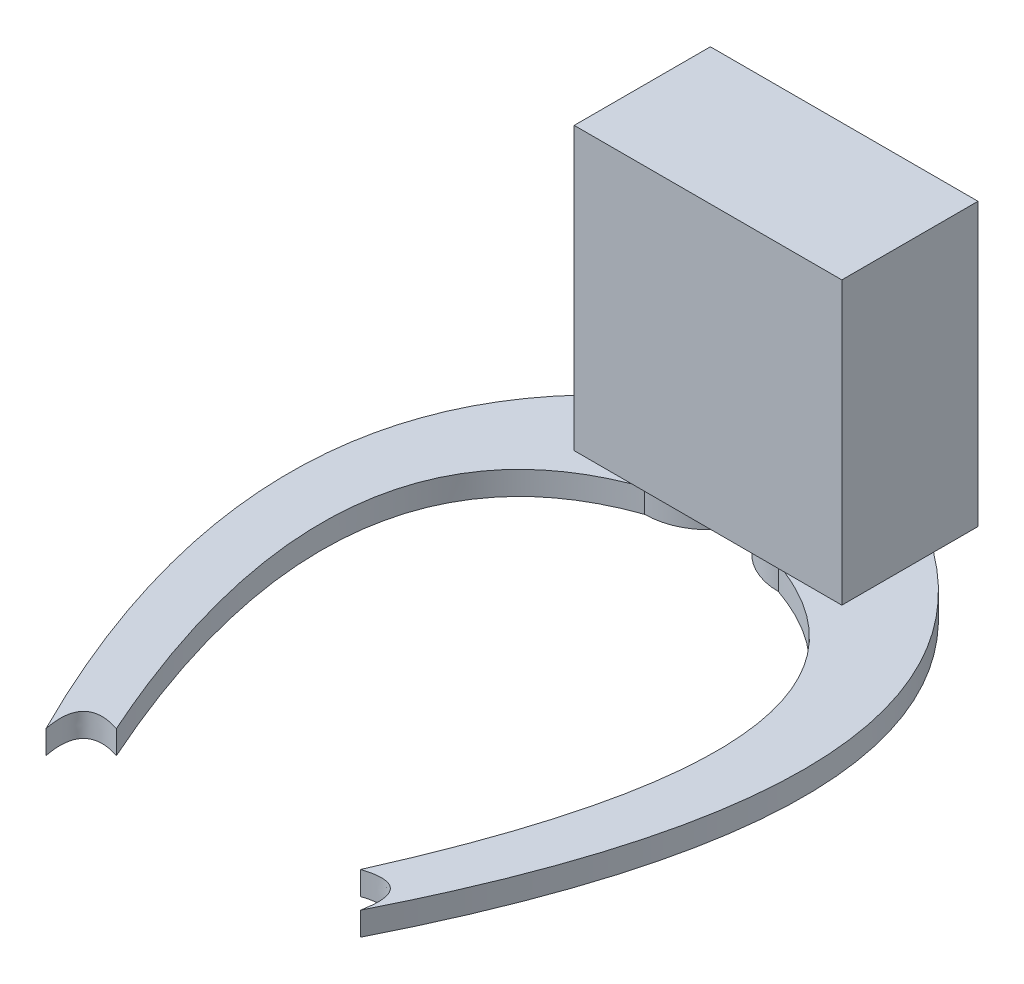
ISO-10303-21;
HEADER;
FILE_DESCRIPTION(('STEP AP214'),'2;1');
FILE_NAME('part.step','',(''),(''),'','','');
FILE_SCHEMA(('AUTOMOTIVE_DESIGN { 1 0 10303 214 1 1 1 1 }'));
ENDSEC;
DATA;
#1=APPLICATION_CONTEXT('core data for automotive mechanical design processes');
#2=APPLICATION_PROTOCOL_DEFINITION('international standard','automotive_design',2000,#1);
#3=PRODUCT_CONTEXT('',#1,'mechanical');
#4=PRODUCT('Part','Part','',(#3));
#5=PRODUCT_RELATED_PRODUCT_CATEGORY('part','',(#4));
#6=PRODUCT_DEFINITION_FORMATION('','',#4);
#7=PRODUCT_DEFINITION_CONTEXT('part definition',#1,'design');
#8=PRODUCT_DEFINITION('design','',#6,#7);
#9=PRODUCT_DEFINITION_SHAPE('','',#8);
#10=(LENGTH_UNIT() NAMED_UNIT(*) SI_UNIT(.MILLI.,.METRE.));
#11=(NAMED_UNIT(*) PLANE_ANGLE_UNIT() SI_UNIT($,.RADIAN.));
#12=(NAMED_UNIT(*) SI_UNIT($,.STERADIAN.) SOLID_ANGLE_UNIT());
#13=UNCERTAINTY_MEASURE_WITH_UNIT(LENGTH_MEASURE(1.E-05),#10,'distance_accuracy_value','');
#14=(GEOMETRIC_REPRESENTATION_CONTEXT(3) GLOBAL_UNCERTAINTY_ASSIGNED_CONTEXT((#13)) GLOBAL_UNIT_ASSIGNED_CONTEXT((#10,
#11,#12)) REPRESENTATION_CONTEXT('',''));
#15=CARTESIAN_POINT('',(0.,0.,0.));
#16=DIRECTION('',(0.,0.,1.));
#17=DIRECTION('',(1.,0.,0.));
#18=AXIS2_PLACEMENT_3D('',#15,#16,#17);
#19=CARTESIAN_POINT('',(-11.4,0.,11.6));
#20=DIRECTION('',(0.,1.,0.));
#21=DIRECTION('',(0.,0.,1.));
#22=AXIS2_PLACEMENT_3D('',#19,#20,#21);
#23=PLANE('',#22);
#24=CARTESIAN_POINT('',(10.4,0.,51.6));
#25=CARTESIAN_POINT('',(25.2903459098613,0.,18.1952198786538));
#26=CARTESIAN_POINT('',(5.7,0.,11.3));
#27=B_SPLINE_CURVE_WITH_KNOTS('',2,(#24,#25,#26),.UNSPECIFIED.,.F.,.F.,(3,3),(0.,1.),.UNSPECIFIED.);
#28=CARTESIAN_POINT('',(6.50432197418804,0.,11.6));
#29=VERTEX_POINT('',#28);
#30=CARTESIAN_POINT('',(5.7,0.,11.3));
#31=VERTEX_POINT('',#30);
#32=EDGE_CURVE('E366',#29,#31,#27,.T.);
#33=ORIENTED_EDGE('',*,*,#32,.F.);
#34=DIRECTION('',(1.,0.,0.));
#35=VECTOR('',#34,1.);
#36=CARTESIAN_POINT('',(-11.4,0.,11.6));
#37=LINE('',#36,#35);
#38=CARTESIAN_POINT('',(-6.50432197137762,0.,11.6));
#39=VERTEX_POINT('',#38);
#40=EDGE_CURVE('E325',#39,#29,#37,.T.);
#41=ORIENTED_EDGE('',*,*,#40,.F.);
#42=CARTESIAN_POINT('',(-5.7,0.,11.3));
#43=CARTESIAN_POINT('',(-25.2903459098613,0.,18.1952198786538));
#44=CARTESIAN_POINT('',(-10.4,0.,51.6));
#45=B_SPLINE_CURVE_WITH_KNOTS('',2,(#42,#43,#44),.UNSPECIFIED.,.F.,.F.,(3,3),(0.,1.),.UNSPECIFIED.);
#46=CARTESIAN_POINT('',(-5.7,0.,11.3));
#47=VERTEX_POINT('',#46);
#48=EDGE_CURVE('E50',#47,#39,#45,.T.);
#49=ORIENTED_EDGE('',*,*,#48,.F.);
#50=CARTESIAN_POINT('',(-5.7,0.,5.8));
#51=DIRECTION('',(0.,-1.,0.));
#52=DIRECTION('',(0.,0.,1.));
#53=AXIS2_PLACEMENT_3D('',#50,#51,#52);
#54=CIRCLE('',#53,5.5);
#55=CARTESIAN_POINT('',(-5.7,0.,0.3));
#56=VERTEX_POINT('',#55);
#57=EDGE_CURVE('E179',#56,#47,#54,.T.);
#58=ORIENTED_EDGE('',*,*,#57,.F.);
#59=CARTESIAN_POINT('',(-13.4,0.,54.6));
#60=CARTESIAN_POINT('',(-33.6503436316819,0.,14.2350031649345));
#61=CARTESIAN_POINT('',(-5.7,0.,0.3));
#62=B_SPLINE_CURVE_WITH_KNOTS('',2,(#59,#60,#61),.UNSPECIFIED.,.F.,.F.,(3,3),(0.,1.),.UNSPECIFIED.);
#63=CARTESIAN_POINT('',(-11.4,0.,3.78581551117855));
#64=VERTEX_POINT('',#63);
#65=EDGE_CURVE('E11',#64,#56,#62,.T.);
#66=ORIENTED_EDGE('',*,*,#65,.F.);
#67=DIRECTION('',(0.,0.,-1.));
#68=VECTOR('',#67,1.);
#69=CARTESIAN_POINT('',(-11.4,0.,11.6));
#70=LINE('',#69,#68);
#71=CARTESIAN_POINT('',(-11.4,0.,0.));
#72=VERTEX_POINT('',#71);
#73=EDGE_CURVE('E345',#64,#72,#70,.T.);
#74=ORIENTED_EDGE('',*,*,#73,.T.);
#75=DIRECTION('',(1.,0.,0.));
#76=VECTOR('',#75,1.);
#77=CARTESIAN_POINT('',(-11.4,0.,0.));
#78=LINE('',#77,#76);
#79=CARTESIAN_POINT('',(11.4,0.,0.));
#80=VERTEX_POINT('',#79);
#81=EDGE_CURVE('E332',#72,#80,#78,.T.);
#82=ORIENTED_EDGE('',*,*,#81,.T.);
#83=DIRECTION('',(0.,0.,-1.));
#84=VECTOR('',#83,1.);
#85=CARTESIAN_POINT('',(11.4,0.,11.6));
#86=LINE('',#85,#84);
#87=CARTESIAN_POINT('',(11.3999999999994,0.,3.78581550441487));
#88=VERTEX_POINT('',#87);
#89=EDGE_CURVE('E342',#88,#80,#86,.T.);
#90=ORIENTED_EDGE('',*,*,#89,.F.);
#91=CARTESIAN_POINT('',(5.7,0.,0.3));
#92=CARTESIAN_POINT('',(33.6503436316819,0.,14.2350031649345));
#93=CARTESIAN_POINT('',(13.4,0.,54.6));
#94=B_SPLINE_CURVE_WITH_KNOTS('',2,(#91,#92,#93),.UNSPECIFIED.,.F.,.F.,(3,3),(0.,1.),.UNSPECIFIED.);
#95=CARTESIAN_POINT('',(5.7,0.,0.3));
#96=VERTEX_POINT('',#95);
#97=EDGE_CURVE('E155',#96,#88,#94,.T.);
#98=ORIENTED_EDGE('',*,*,#97,.F.);
#99=CARTESIAN_POINT('',(5.7,0.,5.8));
#100=DIRECTION('',(0.,-1.,0.));
#101=DIRECTION('',(0.,0.,-1.));
#102=AXIS2_PLACEMENT_3D('',#99,#100,#101);
#103=CIRCLE('',#102,5.5);
#104=EDGE_CURVE('E367',#31,#96,#103,.T.);
#105=ORIENTED_EDGE('',*,*,#104,.F.);
#106=EDGE_LOOP('',(#33,#41,#49,#58,#66,#74,#82,#90,#98,#105));
#107=FACE_BOUND('',#106,.T.);
#108=ADVANCED_FACE('F33',(#107),#23,.F.);
#109=CARTESIAN_POINT('',(-11.4,24.,11.6));
#110=DIRECTION('',(1.,0.,0.));
#111=DIRECTION('',(0.,1.,0.));
#112=AXIS2_PLACEMENT_3D('',#109,#110,#111);
#113=PLANE('',#112);
#114=DIRECTION('',(0.,-1.,0.));
#115=VECTOR('',#114,1.);
#116=CARTESIAN_POINT('',(-11.4,24.,0.));
#117=LINE('',#116,#115);
#118=CARTESIAN_POINT('',(-11.4,24.,0.));
#119=VERTEX_POINT('',#118);
#120=EDGE_CURVE('E316',#119,#72,#117,.T.);
#121=ORIENTED_EDGE('',*,*,#120,.T.);
#122=ORIENTED_EDGE('',*,*,#73,.F.);
#123=CARTESIAN_POINT('',(-11.4,0.,11.6));
#124=VERTEX_POINT('',#123);
#125=EDGE_CURVE('E37',#124,#64,#70,.T.);
#126=ORIENTED_EDGE('',*,*,#125,.F.);
#127=DIRECTION('',(0.,-1.,0.));
#128=VECTOR('',#127,1.);
#129=CARTESIAN_POINT('',(-11.4,24.,11.6));
#130=LINE('',#129,#128);
#131=CARTESIAN_POINT('',(-11.4,24.,11.6));
#132=VERTEX_POINT('',#131);
#133=EDGE_CURVE('E317',#132,#124,#130,.T.);
#134=ORIENTED_EDGE('',*,*,#133,.F.);
#135=DIRECTION('',(0.,0.,-1.));
#136=VECTOR('',#135,1.);
#137=CARTESIAN_POINT('',(-11.4,24.,11.6));
#138=LINE('',#137,#136);
#139=EDGE_CURVE('E329',#132,#119,#138,.T.);
#140=ORIENTED_EDGE('',*,*,#139,.T.);
#141=EDGE_LOOP('',(#121,#122,#126,#134,#140));
#142=FACE_BOUND('',#141,.T.);
#143=ADVANCED_FACE('F35',(#142),#113,.F.);
#144=CARTESIAN_POINT('',(11.4,24.,11.6));
#145=DIRECTION('',(-1.,0.,0.));
#146=DIRECTION('',(0.,-1.,0.));
#147=AXIS2_PLACEMENT_3D('',#144,#145,#146);
#148=PLANE('',#147);
#149=DIRECTION('',(0.,1.,0.));
#150=VECTOR('',#149,1.);
#151=CARTESIAN_POINT('',(11.4,24.,0.));
#152=LINE('',#151,#150);
#153=CARTESIAN_POINT('',(11.4,24.,0.));
#154=VERTEX_POINT('',#153);
#155=EDGE_CURVE('E335',#80,#154,#152,.T.);
#156=ORIENTED_EDGE('',*,*,#155,.T.);
#157=DIRECTION('',(0.,0.,-1.));
#158=VECTOR('',#157,1.);
#159=CARTESIAN_POINT('',(11.4,24.,11.6));
#160=LINE('',#159,#158);
#161=CARTESIAN_POINT('',(11.4,24.,11.6));
#162=VERTEX_POINT('',#161);
#163=EDGE_CURVE('E340',#162,#154,#160,.T.);
#164=ORIENTED_EDGE('',*,*,#163,.F.);
#165=DIRECTION('',(0.,1.,0.));
#166=VECTOR('',#165,1.);
#167=CARTESIAN_POINT('',(11.4,24.,11.6));
#168=LINE('',#167,#166);
#169=CARTESIAN_POINT('',(11.4,0.,11.6));
#170=VERTEX_POINT('',#169);
#171=EDGE_CURVE('E324',#170,#162,#168,.T.);
#172=ORIENTED_EDGE('',*,*,#171,.F.);
#173=EDGE_CURVE('E343',#170,#88,#86,.T.);
#174=ORIENTED_EDGE('',*,*,#173,.T.);
#175=ORIENTED_EDGE('',*,*,#89,.T.);
#176=EDGE_LOOP('',(#156,#164,#172,#174,#175));
#177=FACE_BOUND('',#176,.T.);
#178=ADVANCED_FACE('F208',(#177),#148,.F.);
#179=CARTESIAN_POINT('',(-11.4,24.,11.6));
#180=DIRECTION('',(0.,-1.,0.));
#181=DIRECTION('',(1.,0.,0.));
#182=AXIS2_PLACEMENT_3D('',#179,#180,#181);
#183=PLANE('',#182);
#184=DIRECTION('',(-1.,0.,0.));
#185=VECTOR('',#184,1.);
#186=CARTESIAN_POINT('',(-11.4,24.,0.));
#187=LINE('',#186,#185);
#188=EDGE_CURVE('E320',#154,#119,#187,.T.);
#189=ORIENTED_EDGE('',*,*,#188,.T.);
#190=ORIENTED_EDGE('',*,*,#139,.F.);
#191=DIRECTION('',(-1.,0.,0.));
#192=VECTOR('',#191,1.);
#193=CARTESIAN_POINT('',(-11.4,24.,11.6));
#194=LINE('',#193,#192);
#195=EDGE_CURVE('E327',#162,#132,#194,.T.);
#196=ORIENTED_EDGE('',*,*,#195,.F.);
#197=ORIENTED_EDGE('',*,*,#163,.T.);
#198=EDGE_LOOP('',(#189,#190,#196,#197));
#199=FACE_BOUND('',#198,.T.);
#200=ADVANCED_FACE('F200',(#199),#183,.F.);
#201=CARTESIAN_POINT('',(0.,0.,11.6));
#202=DIRECTION('',(0.,0.,1.));
#203=DIRECTION('',(1.,0.,0.));
#204=AXIS2_PLACEMENT_3D('',#201,#202,#203);
#205=PLANE('',#204);
#206=ORIENTED_EDGE('',*,*,#133,.T.);
#207=EDGE_CURVE('E321',#124,#39,#37,.T.);
#208=ORIENTED_EDGE('',*,*,#207,.T.);
#209=ORIENTED_EDGE('',*,*,#40,.T.);
#210=EDGE_CURVE('E319',#29,#170,#37,.T.);
#211=ORIENTED_EDGE('',*,*,#210,.T.);
#212=ORIENTED_EDGE('',*,*,#171,.T.);
#213=ORIENTED_EDGE('',*,*,#195,.T.);
#214=EDGE_LOOP('',(#206,#208,#209,#211,#212,#213));
#215=FACE_BOUND('',#214,.T.);
#216=ADVANCED_FACE('F196',(#215),#205,.T.);
#217=CARTESIAN_POINT('',(0.,0.,0.));
#218=DIRECTION('',(0.,0.,1.));
#219=DIRECTION('',(1.,0.,0.));
#220=AXIS2_PLACEMENT_3D('',#217,#218,#219);
#221=PLANE('',#220);
#222=ORIENTED_EDGE('',*,*,#120,.F.);
#223=ORIENTED_EDGE('',*,*,#188,.F.);
#224=ORIENTED_EDGE('',*,*,#155,.F.);
#225=ORIENTED_EDGE('',*,*,#81,.F.);
#226=EDGE_LOOP('',(#222,#223,#224,#225));
#227=FACE_BOUND('',#226,.T.);
#228=ADVANCED_FACE('F199',(#227),#221,.F.);
#229=CARTESIAN_POINT('',(-16.6701729549307,-2.,24.8226099393269));
#230=DIRECTION('',(0.,-1.,0.));
#231=DIRECTION('',(0.,0.,-1.));
#232=AXIS2_PLACEMENT_3D('',#229,#230,#231);
#233=PLANE('',#232);
#234=CARTESIAN_POINT('',(-5.7,-2.,11.3));
#235=CARTESIAN_POINT('',(-25.2903459098613,-2.,18.1952198786538));
#236=CARTESIAN_POINT('',(-10.4,-2.,51.6));
#237=B_SPLINE_CURVE_WITH_KNOTS('',2,(#234,#235,#236),.UNSPECIFIED.,.F.,.F.,(3,3),(0.,1.),.UNSPECIFIED.);
#238=CARTESIAN_POINT('',(-5.7,-2.,11.3));
#239=VERTEX_POINT('',#238);
#240=CARTESIAN_POINT('',(-10.4,-2.,51.6));
#241=VERTEX_POINT('',#240);
#242=EDGE_CURVE('E172',#239,#241,#237,.T.);
#243=ORIENTED_EDGE('',*,*,#242,.T.);
#244=CARTESIAN_POINT('',(-10.4,-2.,51.6));
#245=CARTESIAN_POINT('',(-14.2315683260074,-2.,50.3596145237699));
#246=CARTESIAN_POINT('',(-13.4,-2.,54.6));
#247=B_SPLINE_CURVE_WITH_KNOTS('',2,(#244,#245,#246),.UNSPECIFIED.,.F.,.F.,(3,3),(0.,1.),.UNSPECIFIED.);
#248=CARTESIAN_POINT('',(-13.4,-2.,54.6));
#249=VERTEX_POINT('',#248);
#250=EDGE_CURVE('E178',#241,#249,#247,.T.);
#251=ORIENTED_EDGE('',*,*,#250,.T.);
#252=CARTESIAN_POINT('',(-13.4,-2.,54.6));
#253=CARTESIAN_POINT('',(-33.6503436316819,-2.,14.2350031649345));
#254=CARTESIAN_POINT('',(-5.7,-2.,0.3));
#255=B_SPLINE_CURVE_WITH_KNOTS('',2,(#252,#253,#254),.UNSPECIFIED.,.F.,.F.,(3,3),(0.,1.),.UNSPECIFIED.);
#256=CARTESIAN_POINT('',(-5.7,-2.,0.3));
#257=VERTEX_POINT('',#256);
#258=EDGE_CURVE('E274',#249,#257,#255,.T.);
#259=ORIENTED_EDGE('',*,*,#258,.T.);
#260=CARTESIAN_POINT('',(-5.7,-2.,5.8));
#261=DIRECTION('',(0.,-1.,0.));
#262=DIRECTION('',(0.,0.,1.));
#263=AXIS2_PLACEMENT_3D('',#260,#261,#262);
#264=CIRCLE('',#263,5.5);
#265=EDGE_CURVE('E279',#257,#239,#264,.T.);
#266=ORIENTED_EDGE('',*,*,#265,.T.);
#267=EDGE_LOOP('',(#243,#251,#259,#266));
#268=FACE_BOUND('',#267,.T.);
#269=CARTESIAN_POINT('',(-5.7,-2.,5.8));
#270=DIRECTION('',(0.,-1.,0.));
#271=DIRECTION('',(0.,0.,-1.));
#272=AXIS2_PLACEMENT_3D('',#269,#270,#271);
#273=CIRCLE('',#272,2.5);
#274=CARTESIAN_POINT('',(-5.7,-2.,3.3));
#275=VERTEX_POINT('',#274);
#276=EDGE_CURVE('E163',#275,#275,#273,.T.);
#277=ORIENTED_EDGE('',*,*,#276,.F.);
#278=EDGE_LOOP('',(#277));
#279=FACE_BOUND('',#278,.T.);
#280=ADVANCED_FACE('F204',(#268,#279),#233,.T.);
#281=CARTESIAN_POINT('',(-16.6701729549307,0.,24.8226099393269));
#282=DIRECTION('',(0.,-1.,0.));
#283=DIRECTION('',(0.,0.,-1.));
#284=AXIS2_PLACEMENT_3D('',#281,#282,#283);
#285=PLANE('',#284);
#286=ORIENTED_EDGE('',*,*,#207,.F.);
#287=ORIENTED_EDGE('',*,*,#125,.T.);
#288=CARTESIAN_POINT('',(-13.4,0.,54.6));
#289=VERTEX_POINT('',#288);
#290=EDGE_CURVE('E43',#289,#64,#62,.T.);
#291=ORIENTED_EDGE('',*,*,#290,.F.);
#292=CARTESIAN_POINT('',(-10.4,0.,51.6));
#293=CARTESIAN_POINT('',(-14.2315683260074,0.,50.3596145237699));
#294=CARTESIAN_POINT('',(-13.4,0.,54.6));
#295=B_SPLINE_CURVE_WITH_KNOTS('',2,(#292,#293,#294),.UNSPECIFIED.,.F.,.F.,(3,3),(0.,1.),.UNSPECIFIED.);
#296=CARTESIAN_POINT('',(-10.4,0.,51.6));
#297=VERTEX_POINT('',#296);
#298=EDGE_CURVE('E288',#297,#289,#295,.T.);
#299=ORIENTED_EDGE('',*,*,#298,.F.);
#300=EDGE_CURVE('E170',#39,#297,#45,.T.);
#301=ORIENTED_EDGE('',*,*,#300,.F.);
#302=EDGE_LOOP('',(#286,#287,#291,#299,#301));
#303=FACE_BOUND('',#302,.T.);
#304=ADVANCED_FACE('F193',(#303),#285,.F.);
#305=DIRECTION('',(0.,1.,0.));
#306=VECTOR('',#305,1.);
#307=SURFACE_OF_LINEAR_EXTRUSION('',#237,#306);
#308=ORIENTED_EDGE('',*,*,#48,.T.);
#309=ORIENTED_EDGE('',*,*,#300,.T.);
#310=DIRECTION('',(0.,1.,0.));
#311=VECTOR('',#310,1.);
#312=CARTESIAN_POINT('',(-10.4,-2.,51.6));
#313=LINE('',#312,#311);
#314=EDGE_CURVE('E313',#241,#297,#313,.T.);
#315=ORIENTED_EDGE('',*,*,#314,.F.);
#316=ORIENTED_EDGE('',*,*,#242,.F.);
#317=DIRECTION('',(0.,1.,0.));
#318=VECTOR('',#317,1.);
#319=CARTESIAN_POINT('',(-5.7,-2.,11.3));
#320=LINE('',#319,#318);
#321=EDGE_CURVE('E284',#239,#47,#320,.T.);
#322=ORIENTED_EDGE('',*,*,#321,.T.);
#323=EDGE_LOOP('',(#308,#309,#315,#316,#322));
#324=FACE_BOUND('',#323,.T.);
#325=ADVANCED_FACE('F188',(#324),#307,.F.);
#326=DIRECTION('',(0.,1.,0.));
#327=VECTOR('',#326,1.);
#328=SURFACE_OF_LINEAR_EXTRUSION('',#247,#327);
#329=ORIENTED_EDGE('',*,*,#298,.T.);
#330=DIRECTION('',(0.,1.,0.));
#331=VECTOR('',#330,1.);
#332=CARTESIAN_POINT('',(-13.4,-2.,54.6));
#333=LINE('',#332,#331);
#334=EDGE_CURVE('E310',#249,#289,#333,.T.);
#335=ORIENTED_EDGE('',*,*,#334,.F.);
#336=ORIENTED_EDGE('',*,*,#250,.F.);
#337=ORIENTED_EDGE('',*,*,#314,.T.);
#338=EDGE_LOOP('',(#329,#335,#336,#337));
#339=FACE_BOUND('',#338,.T.);
#340=ADVANCED_FACE('F192',(#339),#328,.F.);
#341=DIRECTION('',(0.,1.,0.));
#342=VECTOR('',#341,1.);
#343=SURFACE_OF_LINEAR_EXTRUSION('',#255,#342);
#344=ORIENTED_EDGE('',*,*,#290,.T.);
#345=ORIENTED_EDGE('',*,*,#65,.T.);
#346=DIRECTION('',(0.,1.,0.));
#347=VECTOR('',#346,1.);
#348=CARTESIAN_POINT('',(-5.7,-2.,0.3));
#349=LINE('',#348,#347);
#350=EDGE_CURVE('E307',#257,#56,#349,.T.);
#351=ORIENTED_EDGE('',*,*,#350,.F.);
#352=ORIENTED_EDGE('',*,*,#258,.F.);
#353=ORIENTED_EDGE('',*,*,#334,.T.);
#354=EDGE_LOOP('',(#344,#345,#351,#352,#353));
#355=FACE_BOUND('',#354,.T.);
#356=ADVANCED_FACE('F270',(#355),#343,.F.);
#357=CARTESIAN_POINT('',(-5.7,-2.,5.8));
#358=DIRECTION('',(0.,1.,0.));
#359=DIRECTION('',(0.,0.,1.));
#360=AXIS2_PLACEMENT_3D('',#357,#358,#359);
#361=CYLINDRICAL_SURFACE('',#360,5.5);
#362=ORIENTED_EDGE('',*,*,#57,.T.);
#363=ORIENTED_EDGE('',*,*,#321,.F.);
#364=ORIENTED_EDGE('',*,*,#265,.F.);
#365=ORIENTED_EDGE('',*,*,#350,.T.);
#366=EDGE_LOOP('',(#362,#363,#364,#365));
#367=FACE_BOUND('',#366,.T.);
#368=ADVANCED_FACE('F226',(#367),#361,.T.);
#369=CARTESIAN_POINT('',(-5.7,-2.,5.8));
#370=DIRECTION('',(0.,1.,0.));
#371=DIRECTION('',(0.,0.,1.));
#372=AXIS2_PLACEMENT_3D('',#369,#370,#371);
#373=CYLINDRICAL_SURFACE('',#372,2.5);
#374=ORIENTED_EDGE('',*,*,#276,.T.);
#375=EDGE_LOOP('',(#374));
#376=FACE_BOUND('',#375,.T.);
#377=CARTESIAN_POINT('',(-5.7,0.,5.8));
#378=DIRECTION('',(0.,-1.,0.));
#379=DIRECTION('',(0.,0.,-1.));
#380=AXIS2_PLACEMENT_3D('',#377,#378,#379);
#381=CIRCLE('',#380,2.5);
#382=CARTESIAN_POINT('',(-5.7,0.,3.3));
#383=VERTEX_POINT('',#382);
#384=EDGE_CURVE('E160',#383,#383,#381,.T.);
#385=ORIENTED_EDGE('',*,*,#384,.F.);
#386=EDGE_LOOP('',(#385));
#387=FACE_BOUND('',#386,.T.);
#388=ADVANCED_FACE('F215',(#376,#387),#373,.F.);
#389=ORIENTED_EDGE('',*,*,#384,.T.);
#390=EDGE_LOOP('',(#389));
#391=FACE_BOUND('',#390,.T.);
#392=ADVANCED_FACE('F212',(#391),#23,.F.);
#393=CARTESIAN_POINT('',(13.0657841630037,0.,51.729807261885));
#394=DIRECTION('',(0.,1.,0.));
#395=DIRECTION('',(0.,0.,1.));
#396=AXIS2_PLACEMENT_3D('',#393,#394,#395);
#397=PLANE('',#396);
#398=ORIENTED_EDGE('',*,*,#173,.F.);
#399=ORIENTED_EDGE('',*,*,#210,.F.);
#400=CARTESIAN_POINT('',(10.4,0.,51.6));
#401=VERTEX_POINT('',#400);
#402=EDGE_CURVE('E365',#401,#29,#27,.T.);
#403=ORIENTED_EDGE('',*,*,#402,.F.);
#404=CARTESIAN_POINT('',(13.4,0.,54.6));
#405=CARTESIAN_POINT('',(14.2315683260074,0.,50.3596145237699));
#406=CARTESIAN_POINT('',(10.4,0.,51.6));
#407=B_SPLINE_CURVE_WITH_KNOTS('',2,(#404,#405,#406),.UNSPECIFIED.,.F.,.F.,(3,3),(0.,1.),.UNSPECIFIED.);
#408=CARTESIAN_POINT('',(13.4,0.,54.6));
#409=VERTEX_POINT('',#408);
#410=EDGE_CURVE('E159',#409,#401,#407,.T.);
#411=ORIENTED_EDGE('',*,*,#410,.F.);
#412=EDGE_CURVE('E381',#88,#409,#94,.T.);
#413=ORIENTED_EDGE('',*,*,#412,.F.);
#414=EDGE_LOOP('',(#398,#399,#403,#411,#413));
#415=FACE_BOUND('',#414,.T.);
#416=ADVANCED_FACE('F214',(#415),#397,.T.);
#417=CARTESIAN_POINT('',(13.0657841630037,-2.,51.729807261885));
#418=DIRECTION('',(0.,1.,0.));
#419=DIRECTION('',(0.,0.,1.));
#420=AXIS2_PLACEMENT_3D('',#417,#418,#419);
#421=PLANE('',#420);
#422=CARTESIAN_POINT('',(13.4,-2.,54.6));
#423=CARTESIAN_POINT('',(14.2315683260074,-2.,50.3596145237699));
#424=CARTESIAN_POINT('',(10.4,-2.,51.6));
#425=B_SPLINE_CURVE_WITH_KNOTS('',2,(#422,#423,#424),.UNSPECIFIED.,.F.,.F.,(3,3),(0.,1.),.UNSPECIFIED.);
#426=CARTESIAN_POINT('',(13.4,-2.,54.6));
#427=VERTEX_POINT('',#426);
#428=CARTESIAN_POINT('',(10.4,-2.,51.6));
#429=VERTEX_POINT('',#428);
#430=EDGE_CURVE('E145',#427,#429,#425,.T.);
#431=ORIENTED_EDGE('',*,*,#430,.T.);
#432=CARTESIAN_POINT('',(10.4,-2.,51.6));
#433=CARTESIAN_POINT('',(25.2903459098613,-2.,18.1952198786538));
#434=CARTESIAN_POINT('',(5.7,-2.,11.3));
#435=B_SPLINE_CURVE_WITH_KNOTS('',2,(#432,#433,#434),.UNSPECIFIED.,.F.,.F.,(3,3),(0.,1.),.UNSPECIFIED.);
#436=CARTESIAN_POINT('',(5.7,-2.,11.3));
#437=VERTEX_POINT('',#436);
#438=EDGE_CURVE('E133',#429,#437,#435,.T.);
#439=ORIENTED_EDGE('',*,*,#438,.T.);
#440=CARTESIAN_POINT('',(5.7,-2.,5.8));
#441=DIRECTION('',(0.,-1.,0.));
#442=DIRECTION('',(0.,0.,-1.));
#443=AXIS2_PLACEMENT_3D('',#440,#441,#442);
#444=CIRCLE('',#443,5.5);
#445=CARTESIAN_POINT('',(5.7,-2.,0.3));
#446=VERTEX_POINT('',#445);
#447=EDGE_CURVE('E144',#437,#446,#444,.T.);
#448=ORIENTED_EDGE('',*,*,#447,.T.);
#449=CARTESIAN_POINT('',(5.7,-2.,0.3));
#450=CARTESIAN_POINT('',(33.6503436316819,-2.,14.2350031649345));
#451=CARTESIAN_POINT('',(13.4,-2.,54.6));
#452=B_SPLINE_CURVE_WITH_KNOTS('',2,(#449,#450,#451),.UNSPECIFIED.,.F.,.F.,(3,3),(0.,1.),.UNSPECIFIED.);
#453=EDGE_CURVE('E151',#446,#427,#452,.T.);
#454=ORIENTED_EDGE('',*,*,#453,.T.);
#455=EDGE_LOOP('',(#431,#439,#448,#454));
#456=FACE_BOUND('',#455,.T.);
#457=CARTESIAN_POINT('',(5.7,-2.,5.8));
#458=DIRECTION('',(0.,-1.,0.));
#459=DIRECTION('',(0.,0.,1.));
#460=AXIS2_PLACEMENT_3D('',#457,#458,#459);
#461=CIRCLE('',#460,2.5);
#462=CARTESIAN_POINT('',(5.7,-2.,8.3));
#463=VERTEX_POINT('',#462);
#464=EDGE_CURVE('E244',#463,#463,#461,.T.);
#465=ORIENTED_EDGE('',*,*,#464,.F.);
#466=EDGE_LOOP('',(#465));
#467=FACE_BOUND('',#466,.T.);
#468=ADVANCED_FACE('F148',(#456,#467),#421,.F.);
#469=DIRECTION('',(0.,1.,0.));
#470=VECTOR('',#469,1.);
#471=SURFACE_OF_LINEAR_EXTRUSION('',#425,#470);
#472=ORIENTED_EDGE('',*,*,#410,.T.);
#473=DIRECTION('',(0.,1.,0.));
#474=VECTOR('',#473,1.);
#475=CARTESIAN_POINT('',(10.4,-2.,51.6));
#476=LINE('',#475,#474);
#477=EDGE_CURVE('E138',#429,#401,#476,.T.);
#478=ORIENTED_EDGE('',*,*,#477,.F.);
#479=ORIENTED_EDGE('',*,*,#430,.F.);
#480=DIRECTION('',(0.,1.,0.));
#481=VECTOR('',#480,1.);
#482=CARTESIAN_POINT('',(13.4,-2.,54.6));
#483=LINE('',#482,#481);
#484=EDGE_CURVE('E386',#427,#409,#483,.T.);
#485=ORIENTED_EDGE('',*,*,#484,.T.);
#486=EDGE_LOOP('',(#472,#478,#479,#485));
#487=FACE_BOUND('',#486,.T.);
#488=ADVANCED_FACE('F157',(#487),#471,.F.);
#489=DIRECTION('',(0.,1.,0.));
#490=VECTOR('',#489,1.);
#491=SURFACE_OF_LINEAR_EXTRUSION('',#435,#490);
#492=ORIENTED_EDGE('',*,*,#402,.T.);
#493=ORIENTED_EDGE('',*,*,#32,.T.);
#494=DIRECTION('',(0.,1.,0.));
#495=VECTOR('',#494,1.);
#496=CARTESIAN_POINT('',(5.7,-2.,11.3));
#497=LINE('',#496,#495);
#498=EDGE_CURVE('E141',#437,#31,#497,.T.);
#499=ORIENTED_EDGE('',*,*,#498,.F.);
#500=ORIENTED_EDGE('',*,*,#438,.F.);
#501=ORIENTED_EDGE('',*,*,#477,.T.);
#502=EDGE_LOOP('',(#492,#493,#499,#500,#501));
#503=FACE_BOUND('',#502,.T.);
#504=ADVANCED_FACE('F136',(#503),#491,.F.);
#505=CARTESIAN_POINT('',(5.7,-2.,5.8));
#506=DIRECTION('',(0.,1.,0.));
#507=DIRECTION('',(0.,0.,1.));
#508=AXIS2_PLACEMENT_3D('',#505,#506,#507);
#509=CYLINDRICAL_SURFACE('',#508,5.5);
#510=ORIENTED_EDGE('',*,*,#104,.T.);
#511=DIRECTION('',(0.,1.,0.));
#512=VECTOR('',#511,1.);
#513=CARTESIAN_POINT('',(5.7,-2.,0.3));
#514=LINE('',#513,#512);
#515=EDGE_CURVE('E165',#446,#96,#514,.T.);
#516=ORIENTED_EDGE('',*,*,#515,.F.);
#517=ORIENTED_EDGE('',*,*,#447,.F.);
#518=ORIENTED_EDGE('',*,*,#498,.T.);
#519=EDGE_LOOP('',(#510,#516,#517,#518));
#520=FACE_BOUND('',#519,.T.);
#521=ADVANCED_FACE('F394',(#520),#509,.T.);
#522=DIRECTION('',(0.,1.,0.));
#523=VECTOR('',#522,1.);
#524=SURFACE_OF_LINEAR_EXTRUSION('',#452,#523);
#525=ORIENTED_EDGE('',*,*,#97,.T.);
#526=ORIENTED_EDGE('',*,*,#412,.T.);
#527=ORIENTED_EDGE('',*,*,#484,.F.);
#528=ORIENTED_EDGE('',*,*,#453,.F.);
#529=ORIENTED_EDGE('',*,*,#515,.T.);
#530=EDGE_LOOP('',(#525,#526,#527,#528,#529));
#531=FACE_BOUND('',#530,.T.);
#532=ADVANCED_FACE('F237',(#531),#524,.F.);
#533=CARTESIAN_POINT('',(5.7,-2.,5.8));
#534=DIRECTION('',(0.,1.,0.));
#535=DIRECTION('',(0.,0.,1.));
#536=AXIS2_PLACEMENT_3D('',#533,#534,#535);
#537=CYLINDRICAL_SURFACE('',#536,2.5);
#538=ORIENTED_EDGE('',*,*,#464,.T.);
#539=EDGE_LOOP('',(#538));
#540=FACE_BOUND('',#539,.T.);
#541=CARTESIAN_POINT('',(5.7,0.,5.8));
#542=DIRECTION('',(0.,-1.,0.));
#543=DIRECTION('',(0.,0.,1.));
#544=AXIS2_PLACEMENT_3D('',#541,#542,#543);
#545=CIRCLE('',#544,2.5);
#546=CARTESIAN_POINT('',(5.7,0.,8.3));
#547=VERTEX_POINT('',#546);
#548=EDGE_CURVE('E242',#547,#547,#545,.T.);
#549=ORIENTED_EDGE('',*,*,#548,.F.);
#550=EDGE_LOOP('',(#549));
#551=FACE_BOUND('',#550,.T.);
#552=ADVANCED_FACE('F231',(#540,#551),#537,.F.);
#553=ORIENTED_EDGE('',*,*,#548,.T.);
#554=EDGE_LOOP('',(#553));
#555=FACE_BOUND('',#554,.T.);
#556=ADVANCED_FACE('F217',(#555),#23,.F.);
#557=CLOSED_SHELL('',(#108,#143,#178,#200,#216,#228,#280,#304,#325,#340,#356,#368,#388,#392,
#416,#468,#488,#504,#521,#532,#552,#556));
#558=MANIFOLD_SOLID_BREP('B2',#557);
#559=ADVANCED_BREP_SHAPE_REPRESENTATION('',(#18,#558),#14);
#560=SHAPE_DEFINITION_REPRESENTATION(#9,#559);
ENDSEC;
END-ISO-10303-21;
